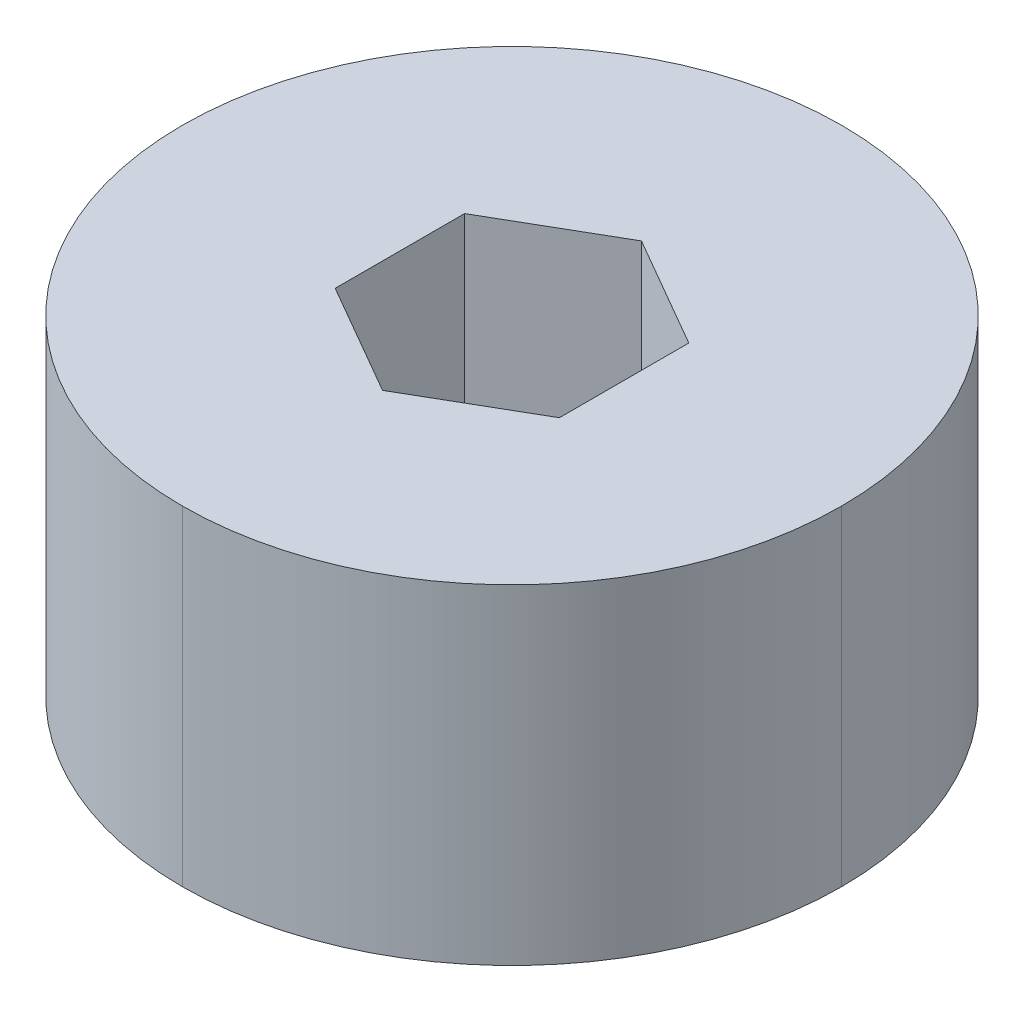
ISO-10303-21;
HEADER;
FILE_DESCRIPTION(('STEP AP214'),'2;1');
FILE_NAME('part.step','',(''),(''),'','','');
FILE_SCHEMA(('AUTOMOTIVE_DESIGN { 1 0 10303 214 1 1 1 1 }'));
ENDSEC;
DATA;
#1=APPLICATION_CONTEXT('core data for automotive mechanical design processes');
#2=APPLICATION_PROTOCOL_DEFINITION('international standard','automotive_design',2000,#1);
#3=PRODUCT_CONTEXT('',#1,'mechanical');
#4=PRODUCT('Part','Part','',(#3));
#5=PRODUCT_RELATED_PRODUCT_CATEGORY('part','',(#4));
#6=PRODUCT_DEFINITION_FORMATION('','',#4);
#7=PRODUCT_DEFINITION_CONTEXT('part definition',#1,'design');
#8=PRODUCT_DEFINITION('design','',#6,#7);
#9=PRODUCT_DEFINITION_SHAPE('','',#8);
#10=(LENGTH_UNIT() NAMED_UNIT(*) SI_UNIT(.MILLI.,.METRE.));
#11=(NAMED_UNIT(*) PLANE_ANGLE_UNIT() SI_UNIT($,.RADIAN.));
#12=(NAMED_UNIT(*) SI_UNIT($,.STERADIAN.) SOLID_ANGLE_UNIT());
#13=UNCERTAINTY_MEASURE_WITH_UNIT(LENGTH_MEASURE(1.E-05),#10,'distance_accuracy_value','');
#14=(GEOMETRIC_REPRESENTATION_CONTEXT(3) GLOBAL_UNCERTAINTY_ASSIGNED_CONTEXT((#13)) GLOBAL_UNIT_ASSIGNED_CONTEXT((#10,
#11,#12)) REPRESENTATION_CONTEXT('',''));
#15=CARTESIAN_POINT('',(0.,0.,0.));
#16=DIRECTION('',(0.,0.,1.));
#17=DIRECTION('',(1.,0.,0.));
#18=AXIS2_PLACEMENT_3D('',#15,#16,#17);
#19=CARTESIAN_POINT('',(0.,10.,0.));
#20=DIRECTION('',(0.,-1.,0.));
#21=DIRECTION('',(0.,0.,-1.));
#22=AXIS2_PLACEMENT_3D('',#19,#20,#21);
#23=PLANE('',#22);
#24=DIRECTION('',(-0.866025403784439,0.,0.5));
#25=VECTOR('',#24,1.);
#26=CARTESIAN_POINT('',(0.,10.,-3.92598183048946));
#27=LINE('',#26,#25);
#28=CARTESIAN_POINT('',(0.,10.,-3.92598183048946));
#29=VERTEX_POINT('',#28);
#30=CARTESIAN_POINT('',(-3.4,10.,-1.96299091524473));
#31=VERTEX_POINT('',#30);
#32=EDGE_CURVE('E149',#29,#31,#27,.T.);
#33=ORIENTED_EDGE('',*,*,#32,.F.);
#34=DIRECTION('',(-0.866025403784438,0.,-0.5));
#35=VECTOR('',#34,1.);
#36=CARTESIAN_POINT('',(3.4,10.,-1.96299091524473));
#37=LINE('',#36,#35);
#38=CARTESIAN_POINT('',(3.4,10.,-1.96299091524473));
#39=VERTEX_POINT('',#38);
#40=EDGE_CURVE('E117',#39,#29,#37,.T.);
#41=ORIENTED_EDGE('',*,*,#40,.F.);
#42=DIRECTION('',(0.,0.,-1.));
#43=VECTOR('',#42,1.);
#44=CARTESIAN_POINT('',(3.4,10.,1.96299091524473));
#45=LINE('',#44,#43);
#46=CARTESIAN_POINT('',(3.4,10.,1.96299091524473));
#47=VERTEX_POINT('',#46);
#48=EDGE_CURVE('E135',#47,#39,#45,.T.);
#49=ORIENTED_EDGE('',*,*,#48,.F.);
#50=DIRECTION('',(0.866025403784439,0.,-0.5));
#51=VECTOR('',#50,1.);
#52=CARTESIAN_POINT('',(0.,10.,3.92598183048946));
#53=LINE('',#52,#51);
#54=CARTESIAN_POINT('',(0.,10.,3.92598183048946));
#55=VERTEX_POINT('',#54);
#56=EDGE_CURVE('E138',#55,#47,#53,.T.);
#57=ORIENTED_EDGE('',*,*,#56,.F.);
#58=DIRECTION('',(0.866025403784439,0.,0.5));
#59=VECTOR('',#58,1.);
#60=CARTESIAN_POINT('',(-3.4,10.,1.96299091524473));
#61=LINE('',#60,#59);
#62=CARTESIAN_POINT('',(-3.4,10.,1.96299091524473));
#63=VERTEX_POINT('',#62);
#64=EDGE_CURVE('E154',#63,#55,#61,.T.);
#65=ORIENTED_EDGE('',*,*,#64,.F.);
#66=DIRECTION('',(0.,0.,1.));
#67=VECTOR('',#66,1.);
#68=CARTESIAN_POINT('',(-3.4,10.,-1.96299091524473));
#69=LINE('',#68,#67);
#70=EDGE_CURVE('E151',#31,#63,#69,.T.);
#71=ORIENTED_EDGE('',*,*,#70,.F.);
#72=EDGE_LOOP('',(#33,#41,#49,#57,#65,#71));
#73=FACE_BOUND('',#72,.T.);
#74=CARTESIAN_POINT('',(0.,10.,0.));
#75=DIRECTION('',(0.,-1.,0.));
#76=DIRECTION('',(0.,0.,-1.));
#77=AXIS2_PLACEMENT_3D('',#74,#75,#76);
#78=CIRCLE('',#77,10.);
#79=CARTESIAN_POINT('',(0.,10.,10.));
#80=VERTEX_POINT('',#79);
#81=CARTESIAN_POINT('',(10.,10.,0.));
#82=VERTEX_POINT('',#81);
#83=EDGE_CURVE('E42',#80,#82,#78,.F.);
#84=ORIENTED_EDGE('',*,*,#83,.T.);
#85=CARTESIAN_POINT('',(0.,10.,0.));
#86=DIRECTION('',(0.,-1.,0.));
#87=DIRECTION('',(0.,0.,-1.));
#88=AXIS2_PLACEMENT_3D('',#85,#86,#87);
#89=CIRCLE('',#88,10.);
#90=CARTESIAN_POINT('',(0.,10.,-10.));
#91=VERTEX_POINT('',#90);
#92=EDGE_CURVE('E11',#82,#91,#89,.F.);
#93=ORIENTED_EDGE('',*,*,#92,.T.);
#94=CARTESIAN_POINT('',(0.,10.,0.));
#95=DIRECTION('',(0.,-1.,0.));
#96=DIRECTION('',(0.,0.,-1.));
#97=AXIS2_PLACEMENT_3D('',#94,#95,#96);
#98=CIRCLE('',#97,10.);
#99=CARTESIAN_POINT('',(-10.,10.,0.));
#100=VERTEX_POINT('',#99);
#101=EDGE_CURVE('E54',#91,#100,#98,.F.);
#102=ORIENTED_EDGE('',*,*,#101,.T.);
#103=CARTESIAN_POINT('',(0.,10.,0.));
#104=DIRECTION('',(0.,-1.,0.));
#105=DIRECTION('',(0.,0.,-1.));
#106=AXIS2_PLACEMENT_3D('',#103,#104,#105);
#107=CIRCLE('',#106,10.);
#108=EDGE_CURVE('E50',#100,#80,#107,.F.);
#109=ORIENTED_EDGE('',*,*,#108,.T.);
#110=EDGE_LOOP('',(#84,#93,#102,#109));
#111=FACE_BOUND('',#110,.T.);
#112=ADVANCED_FACE('F33',(#73,#111),#23,.F.);
#113=CARTESIAN_POINT('',(0.,0.,0.));
#114=DIRECTION('',(0.,-1.,0.));
#115=DIRECTION('',(0.,0.,-1.));
#116=AXIS2_PLACEMENT_3D('',#113,#114,#115);
#117=PLANE('',#116);
#118=CARTESIAN_POINT('',(0.,0.,0.));
#119=DIRECTION('',(0.,-1.,0.));
#120=DIRECTION('',(0.,0.,-1.));
#121=AXIS2_PLACEMENT_3D('',#118,#119,#120);
#122=CIRCLE('',#121,10.);
#123=CARTESIAN_POINT('',(-10.,0.,0.));
#124=VERTEX_POINT('',#123);
#125=CARTESIAN_POINT('',(0.,0.,-10.));
#126=VERTEX_POINT('',#125);
#127=EDGE_CURVE('E170',#124,#126,#122,.T.);
#128=ORIENTED_EDGE('',*,*,#127,.T.);
#129=CARTESIAN_POINT('',(0.,0.,0.));
#130=DIRECTION('',(0.,-1.,0.));
#131=DIRECTION('',(0.,0.,-1.));
#132=AXIS2_PLACEMENT_3D('',#129,#130,#131);
#133=CIRCLE('',#132,10.);
#134=CARTESIAN_POINT('',(10.,0.,0.));
#135=VERTEX_POINT('',#134);
#136=EDGE_CURVE('E174',#126,#135,#133,.T.);
#137=ORIENTED_EDGE('',*,*,#136,.T.);
#138=CARTESIAN_POINT('',(0.,0.,0.));
#139=DIRECTION('',(0.,-1.,0.));
#140=DIRECTION('',(0.,0.,-1.));
#141=AXIS2_PLACEMENT_3D('',#138,#139,#140);
#142=CIRCLE('',#141,10.);
#143=CARTESIAN_POINT('',(0.,0.,10.));
#144=VERTEX_POINT('',#143);
#145=EDGE_CURVE('E172',#135,#144,#142,.T.);
#146=ORIENTED_EDGE('',*,*,#145,.T.);
#147=CARTESIAN_POINT('',(0.,0.,0.));
#148=DIRECTION('',(0.,-1.,0.));
#149=DIRECTION('',(0.,0.,-1.));
#150=AXIS2_PLACEMENT_3D('',#147,#148,#149);
#151=CIRCLE('',#150,10.);
#152=EDGE_CURVE('E161',#144,#124,#151,.T.);
#153=ORIENTED_EDGE('',*,*,#152,.T.);
#154=EDGE_LOOP('',(#128,#137,#146,#153));
#155=FACE_BOUND('',#154,.T.);
#156=ADVANCED_FACE('F197',(#155),#117,.T.);
#157=CARTESIAN_POINT('',(3.4,5.,-1.96299091524473));
#158=DIRECTION('',(0.5,0.,-0.866025403784439));
#159=DIRECTION('',(-0.866025403784439,0.,-0.5));
#160=AXIS2_PLACEMENT_3D('',#157,#158,#159);
#161=PLANE('',#160);
#162=ORIENTED_EDGE('',*,*,#40,.T.);
#163=DIRECTION('',(0.,1.,0.));
#164=VECTOR('',#163,1.);
#165=CARTESIAN_POINT('',(0.,5.,-3.92598183048946));
#166=LINE('',#165,#164);
#167=CARTESIAN_POINT('',(0.,5.,-3.92598183048946));
#168=VERTEX_POINT('',#167);
#169=EDGE_CURVE('E110',#168,#29,#166,.T.);
#170=ORIENTED_EDGE('',*,*,#169,.F.);
#171=DIRECTION('',(-0.866025403784438,0.,-0.5));
#172=VECTOR('',#171,1.);
#173=CARTESIAN_POINT('',(3.4,5.,-1.96299091524473));
#174=LINE('',#173,#172);
#175=CARTESIAN_POINT('',(3.4,5.,-1.96299091524473));
#176=VERTEX_POINT('',#175);
#177=EDGE_CURVE('E114',#176,#168,#174,.T.);
#178=ORIENTED_EDGE('',*,*,#177,.F.);
#179=DIRECTION('',(0.,1.,0.));
#180=VECTOR('',#179,1.);
#181=CARTESIAN_POINT('',(3.4,5.,-1.96299091524473));
#182=LINE('',#181,#180);
#183=EDGE_CURVE('E159',#176,#39,#182,.T.);
#184=ORIENTED_EDGE('',*,*,#183,.T.);
#185=EDGE_LOOP('',(#162,#170,#178,#184));
#186=FACE_BOUND('',#185,.T.);
#187=ADVANCED_FACE('F112',(#186),#161,.F.);
#188=CARTESIAN_POINT('',(3.4,5.,1.96299091524473));
#189=DIRECTION('',(1.,0.,0.));
#190=DIRECTION('',(0.,0.,-1.));
#191=AXIS2_PLACEMENT_3D('',#188,#189,#190);
#192=PLANE('',#191);
#193=ORIENTED_EDGE('',*,*,#48,.T.);
#194=ORIENTED_EDGE('',*,*,#183,.F.);
#195=DIRECTION('',(0.,0.,-1.));
#196=VECTOR('',#195,1.);
#197=CARTESIAN_POINT('',(3.4,5.,1.96299091524473));
#198=LINE('',#197,#196);
#199=CARTESIAN_POINT('',(3.4,5.,1.96299091524473));
#200=VERTEX_POINT('',#199);
#201=EDGE_CURVE('E122',#200,#176,#198,.T.);
#202=ORIENTED_EDGE('',*,*,#201,.F.);
#203=DIRECTION('',(0.,1.,0.));
#204=VECTOR('',#203,1.);
#205=CARTESIAN_POINT('',(3.4,5.,1.96299091524473));
#206=LINE('',#205,#204);
#207=EDGE_CURVE('E162',#200,#47,#206,.T.);
#208=ORIENTED_EDGE('',*,*,#207,.T.);
#209=EDGE_LOOP('',(#193,#194,#202,#208));
#210=FACE_BOUND('',#209,.T.);
#211=ADVANCED_FACE('F230',(#210),#192,.F.);
#212=CARTESIAN_POINT('',(0.,5.,3.92598183048946));
#213=DIRECTION('',(0.5,0.,0.866025403784439));
#214=DIRECTION('',(0.866025403784439,0.,-0.5));
#215=AXIS2_PLACEMENT_3D('',#212,#213,#214);
#216=PLANE('',#215);
#217=ORIENTED_EDGE('',*,*,#56,.T.);
#218=ORIENTED_EDGE('',*,*,#207,.F.);
#219=DIRECTION('',(0.866025403784439,0.,-0.5));
#220=VECTOR('',#219,1.);
#221=CARTESIAN_POINT('',(0.,5.,3.92598183048946));
#222=LINE('',#221,#220);
#223=CARTESIAN_POINT('',(0.,5.,3.92598183048946));
#224=VERTEX_POINT('',#223);
#225=EDGE_CURVE('E145',#224,#200,#222,.T.);
#226=ORIENTED_EDGE('',*,*,#225,.F.);
#227=DIRECTION('',(0.,1.,0.));
#228=VECTOR('',#227,1.);
#229=CARTESIAN_POINT('',(0.,5.,3.92598183048946));
#230=LINE('',#229,#228);
#231=EDGE_CURVE('E164',#224,#55,#230,.T.);
#232=ORIENTED_EDGE('',*,*,#231,.T.);
#233=EDGE_LOOP('',(#217,#218,#226,#232));
#234=FACE_BOUND('',#233,.T.);
#235=ADVANCED_FACE('F233',(#234),#216,.F.);
#236=CARTESIAN_POINT('',(-3.4,5.,1.96299091524473));
#237=DIRECTION('',(-0.5,0.,0.866025403784439));
#238=DIRECTION('',(0.866025403784439,0.,0.5));
#239=AXIS2_PLACEMENT_3D('',#236,#237,#238);
#240=PLANE('',#239);
#241=ORIENTED_EDGE('',*,*,#64,.T.);
#242=ORIENTED_EDGE('',*,*,#231,.F.);
#243=DIRECTION('',(0.866025403784439,0.,0.5));
#244=VECTOR('',#243,1.);
#245=CARTESIAN_POINT('',(-3.4,5.,1.96299091524473));
#246=LINE('',#245,#244);
#247=CARTESIAN_POINT('',(-3.4,5.,1.96299091524473));
#248=VERTEX_POINT('',#247);
#249=EDGE_CURVE('E142',#248,#224,#246,.T.);
#250=ORIENTED_EDGE('',*,*,#249,.F.);
#251=DIRECTION('',(0.,1.,0.));
#252=VECTOR('',#251,1.);
#253=CARTESIAN_POINT('',(-3.4,5.,1.96299091524473));
#254=LINE('',#253,#252);
#255=EDGE_CURVE('E166',#248,#63,#254,.T.);
#256=ORIENTED_EDGE('',*,*,#255,.T.);
#257=EDGE_LOOP('',(#241,#242,#250,#256));
#258=FACE_BOUND('',#257,.T.);
#259=ADVANCED_FACE('F237',(#258),#240,.F.);
#260=CARTESIAN_POINT('',(-3.4,5.,-1.96299091524473));
#261=DIRECTION('',(-1.,0.,0.));
#262=DIRECTION('',(0.,0.,1.));
#263=AXIS2_PLACEMENT_3D('',#260,#261,#262);
#264=PLANE('',#263);
#265=ORIENTED_EDGE('',*,*,#70,.T.);
#266=ORIENTED_EDGE('',*,*,#255,.F.);
#267=DIRECTION('',(0.,0.,1.));
#268=VECTOR('',#267,1.);
#269=CARTESIAN_POINT('',(-3.4,5.,-1.96299091524473));
#270=LINE('',#269,#268);
#271=CARTESIAN_POINT('',(-3.4,5.,-1.96299091524473));
#272=VERTEX_POINT('',#271);
#273=EDGE_CURVE('E130',#272,#248,#270,.T.);
#274=ORIENTED_EDGE('',*,*,#273,.F.);
#275=DIRECTION('',(0.,1.,0.));
#276=VECTOR('',#275,1.);
#277=CARTESIAN_POINT('',(-3.4,5.,-1.96299091524473));
#278=LINE('',#277,#276);
#279=EDGE_CURVE('E121',#272,#31,#278,.T.);
#280=ORIENTED_EDGE('',*,*,#279,.T.);
#281=EDGE_LOOP('',(#265,#266,#274,#280));
#282=FACE_BOUND('',#281,.T.);
#283=ADVANCED_FACE('F228',(#282),#264,.F.);
#284=CARTESIAN_POINT('',(0.,5.,-3.92598183048946));
#285=DIRECTION('',(-0.5,0.,-0.866025403784439));
#286=DIRECTION('',(-0.866025403784439,0.,0.5));
#287=AXIS2_PLACEMENT_3D('',#284,#285,#286);
#288=PLANE('',#287);
#289=ORIENTED_EDGE('',*,*,#32,.T.);
#290=ORIENTED_EDGE('',*,*,#279,.F.);
#291=DIRECTION('',(-0.866025403784439,0.,0.5));
#292=VECTOR('',#291,1.);
#293=CARTESIAN_POINT('',(0.,5.,-3.92598183048946));
#294=LINE('',#293,#292);
#295=EDGE_CURVE('E125',#168,#272,#294,.T.);
#296=ORIENTED_EDGE('',*,*,#295,.F.);
#297=ORIENTED_EDGE('',*,*,#169,.T.);
#298=EDGE_LOOP('',(#289,#290,#296,#297));
#299=FACE_BOUND('',#298,.T.);
#300=ADVANCED_FACE('F126',(#299),#288,.F.);
#301=CARTESIAN_POINT('',(0.,5.,0.));
#302=DIRECTION('',(0.,1.,0.));
#303=DIRECTION('',(0.,0.,1.));
#304=AXIS2_PLACEMENT_3D('',#301,#302,#303);
#305=PLANE('',#304);
#306=ORIENTED_EDGE('',*,*,#177,.T.);
#307=ORIENTED_EDGE('',*,*,#295,.T.);
#308=ORIENTED_EDGE('',*,*,#273,.T.);
#309=ORIENTED_EDGE('',*,*,#249,.T.);
#310=ORIENTED_EDGE('',*,*,#225,.T.);
#311=ORIENTED_EDGE('',*,*,#201,.T.);
#312=EDGE_LOOP('',(#306,#307,#308,#309,#310,#311));
#313=FACE_BOUND('',#312,.T.);
#314=ADVANCED_FACE('F132',(#313),#305,.T.);
#315=CARTESIAN_POINT('',(0.,10.,0.));
#316=DIRECTION('',(0.,-1.,0.));
#317=DIRECTION('',(0.,0.,-1.));
#318=AXIS2_PLACEMENT_3D('',#315,#316,#317);
#319=CYLINDRICAL_SURFACE('',#318,10.);
#320=DIRECTION('',(0.,-1.,0.));
#321=VECTOR('',#320,1.);
#322=CARTESIAN_POINT('',(-10.,10.,0.));
#323=LINE('',#322,#321);
#324=EDGE_CURVE('E183',#124,#100,#323,.F.);
#325=ORIENTED_EDGE('',*,*,#324,.F.);
#326=ORIENTED_EDGE('',*,*,#152,.F.);
#327=DIRECTION('',(0.,-1.,0.));
#328=VECTOR('',#327,1.);
#329=CARTESIAN_POINT('',(0.,10.,10.));
#330=LINE('',#329,#328);
#331=EDGE_CURVE('E37',#80,#144,#330,.T.);
#332=ORIENTED_EDGE('',*,*,#331,.F.);
#333=ORIENTED_EDGE('',*,*,#108,.F.);
#334=EDGE_LOOP('',(#325,#326,#332,#333));
#335=FACE_BOUND('',#334,.T.);
#336=ADVANCED_FACE('F35',(#335),#319,.T.);
#337=CARTESIAN_POINT('',(0.,10.,0.));
#338=DIRECTION('',(0.,-1.,0.));
#339=DIRECTION('',(0.,0.,-1.));
#340=AXIS2_PLACEMENT_3D('',#337,#338,#339);
#341=CYLINDRICAL_SURFACE('',#340,10.);
#342=ORIENTED_EDGE('',*,*,#331,.T.);
#343=ORIENTED_EDGE('',*,*,#145,.F.);
#344=DIRECTION('',(0.,-1.,0.));
#345=VECTOR('',#344,1.);
#346=CARTESIAN_POINT('',(10.,10.,0.));
#347=LINE('',#346,#345);
#348=EDGE_CURVE('E182',#82,#135,#347,.T.);
#349=ORIENTED_EDGE('',*,*,#348,.F.);
#350=ORIENTED_EDGE('',*,*,#83,.F.);
#351=EDGE_LOOP('',(#342,#343,#349,#350));
#352=FACE_BOUND('',#351,.T.);
#353=ADVANCED_FACE('F192',(#352),#341,.T.);
#354=CARTESIAN_POINT('',(0.,10.,0.));
#355=DIRECTION('',(0.,-1.,0.));
#356=DIRECTION('',(0.,0.,-1.));
#357=AXIS2_PLACEMENT_3D('',#354,#355,#356);
#358=CYLINDRICAL_SURFACE('',#357,10.);
#359=ORIENTED_EDGE('',*,*,#324,.T.);
#360=ORIENTED_EDGE('',*,*,#101,.F.);
#361=DIRECTION('',(0.,-1.,0.));
#362=VECTOR('',#361,1.);
#363=CARTESIAN_POINT('',(0.,10.,-10.));
#364=LINE('',#363,#362);
#365=EDGE_CURVE('E180',#126,#91,#364,.F.);
#366=ORIENTED_EDGE('',*,*,#365,.F.);
#367=ORIENTED_EDGE('',*,*,#127,.F.);
#368=EDGE_LOOP('',(#359,#360,#366,#367));
#369=FACE_BOUND('',#368,.T.);
#370=ADVANCED_FACE('F215',(#369),#358,.T.);
#371=CARTESIAN_POINT('',(0.,10.,0.));
#372=DIRECTION('',(0.,-1.,0.));
#373=DIRECTION('',(0.,0.,-1.));
#374=AXIS2_PLACEMENT_3D('',#371,#372,#373);
#375=CYLINDRICAL_SURFACE('',#374,10.);
#376=ORIENTED_EDGE('',*,*,#92,.F.);
#377=ORIENTED_EDGE('',*,*,#348,.T.);
#378=ORIENTED_EDGE('',*,*,#136,.F.);
#379=ORIENTED_EDGE('',*,*,#365,.T.);
#380=EDGE_LOOP('',(#376,#377,#378,#379));
#381=FACE_BOUND('',#380,.T.);
#382=ADVANCED_FACE('F202',(#381),#375,.T.);
#383=CLOSED_SHELL('',(#112,#156,#187,#211,#235,#259,#283,#300,#314,#336,#353,#370,#382));
#384=MANIFOLD_SOLID_BREP('B2',#383);
#385=ADVANCED_BREP_SHAPE_REPRESENTATION('',(#18,#384),#14);
#386=SHAPE_DEFINITION_REPRESENTATION(#9,#385);
ENDSEC;
END-ISO-10303-21;
